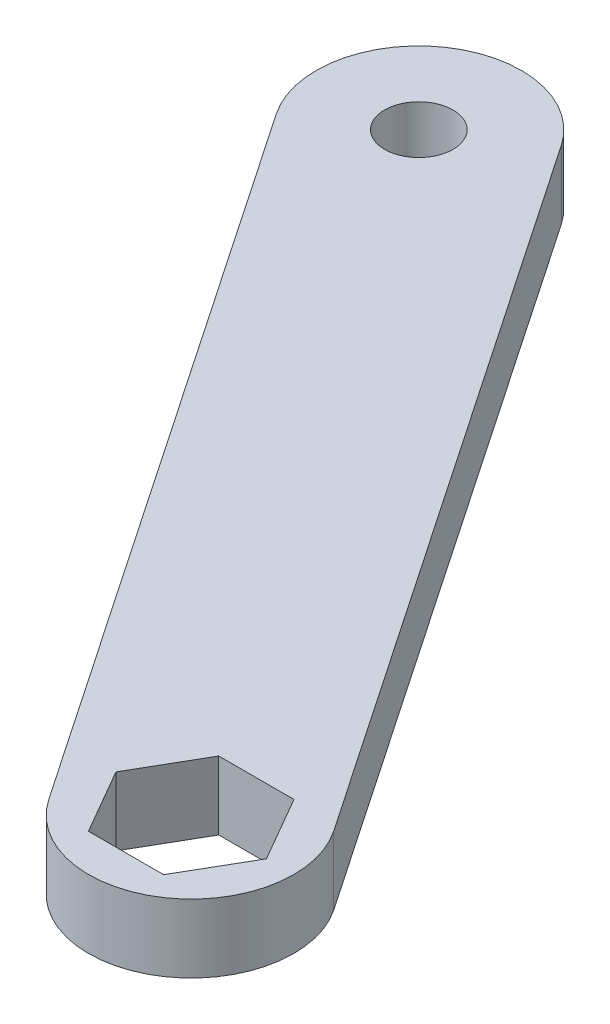
ISO-10303-21;
HEADER;
FILE_DESCRIPTION(('STEP AP214'),'2;1');
FILE_NAME('part.step','',(''),(''),'','','');
FILE_SCHEMA(('AUTOMOTIVE_DESIGN { 1 0 10303 214 1 1 1 1 }'));
ENDSEC;
DATA;
#1=APPLICATION_CONTEXT('core data for automotive mechanical design processes');
#2=APPLICATION_PROTOCOL_DEFINITION('international standard','automotive_design',2000,#1);
#3=PRODUCT_CONTEXT('',#1,'mechanical');
#4=PRODUCT('Part','Part','',(#3));
#5=PRODUCT_RELATED_PRODUCT_CATEGORY('part','',(#4));
#6=PRODUCT_DEFINITION_FORMATION('','',#4);
#7=PRODUCT_DEFINITION_CONTEXT('part definition',#1,'design');
#8=PRODUCT_DEFINITION('design','',#6,#7);
#9=PRODUCT_DEFINITION_SHAPE('','',#8);
#10=(LENGTH_UNIT() NAMED_UNIT(*) SI_UNIT(.MILLI.,.METRE.));
#11=(NAMED_UNIT(*) PLANE_ANGLE_UNIT() SI_UNIT($,.RADIAN.));
#12=(NAMED_UNIT(*) SI_UNIT($,.STERADIAN.) SOLID_ANGLE_UNIT());
#13=UNCERTAINTY_MEASURE_WITH_UNIT(LENGTH_MEASURE(1.E-05),#10,'distance_accuracy_value','');
#14=(GEOMETRIC_REPRESENTATION_CONTEXT(3) GLOBAL_UNCERTAINTY_ASSIGNED_CONTEXT((#13)) GLOBAL_UNIT_ASSIGNED_CONTEXT((#10,
#11,#12)) REPRESENTATION_CONTEXT('',''));
#15=CARTESIAN_POINT('',(0.,0.,0.));
#16=DIRECTION('',(0.,0.,1.));
#17=DIRECTION('',(1.,0.,0.));
#18=AXIS2_PLACEMENT_3D('',#15,#16,#17);
#19=CARTESIAN_POINT('',(-8.5725,-5.,-27.2588126804892));
#20=DIRECTION('',(0.,1.,0.));
#21=DIRECTION('',(0.,0.,1.));
#22=AXIS2_PLACEMENT_3D('',#19,#20,#21);
#23=CYLINDRICAL_SURFACE('',#22,7.49926131403121);
#24=CARTESIAN_POINT('',(-8.5725,0.,-27.2588126804892));
#25=DIRECTION('',(0.,1.,0.));
#26=DIRECTION('',(0.,0.,1.));
#27=AXIS2_PLACEMENT_3D('',#24,#25,#26);
#28=CIRCLE('',#27,7.49926131403121);
#29=CARTESIAN_POINT('',(-14.7786134569005,0.,-23.0489342955232));
#30=VERTEX_POINT('',#29);
#31=CARTESIAN_POINT('',(-2.36638654309953,0.,-31.4686910654552));
#32=VERTEX_POINT('',#31);
#33=EDGE_CURVE('E165',#30,#32,#28,.T.);
#34=ORIENTED_EDGE('',*,*,#33,.F.);
#35=DIRECTION('',(0.,1.,0.));
#36=VECTOR('',#35,1.);
#37=CARTESIAN_POINT('',(-14.7786134569005,-5.,-23.0489342955232));
#38=LINE('',#37,#36);
#39=CARTESIAN_POINT('',(-14.7786134569005,-5.,-23.0489342955232));
#40=VERTEX_POINT('',#39);
#41=EDGE_CURVE('E11',#40,#30,#38,.T.);
#42=ORIENTED_EDGE('',*,*,#41,.F.);
#43=CARTESIAN_POINT('',(-8.5725,-5.,-27.2588126804892));
#44=DIRECTION('',(0.,1.,0.));
#45=DIRECTION('',(0.,0.,1.));
#46=AXIS2_PLACEMENT_3D('',#43,#44,#45);
#47=CIRCLE('',#46,7.49926131403121);
#48=CARTESIAN_POINT('',(-2.36638654309953,-5.,-31.4686910654552));
#49=VERTEX_POINT('',#48);
#50=EDGE_CURVE('E173',#40,#49,#47,.T.);
#51=ORIENTED_EDGE('',*,*,#50,.T.);
#52=DIRECTION('',(0.,1.,0.));
#53=VECTOR('',#52,1.);
#54=CARTESIAN_POINT('',(-2.36638654309953,-5.,-31.4686910654552));
#55=LINE('',#54,#53);
#56=EDGE_CURVE('E42',#49,#32,#55,.T.);
#57=ORIENTED_EDGE('',*,*,#56,.T.);
#58=EDGE_LOOP('',(#34,#42,#51,#57));
#59=FACE_BOUND('',#58,.T.);
#60=ADVANCED_FACE('F39',(#59),#23,.T.);
#61=CARTESIAN_POINT('',(-49.8643889809616,-5.,-74.7716406813572));
#62=DIRECTION('',(-0.827563302173344,0.,0.561372408384979));
#63=DIRECTION('',(0.561372408384979,0.,0.827563302173344));
#64=AXIS2_PLACEMENT_3D('',#61,#62,#63);
#65=PLANE('',#64);
#66=DIRECTION('',(0.561372408384979,0.,0.827563302173344));
#67=VECTOR('',#66,1.);
#68=CARTESIAN_POINT('',(-49.8643889809616,0.,-74.7716406813572));
#69=LINE('',#68,#67);
#70=CARTESIAN_POINT('',(-49.8643889809616,0.,-74.7716406813572));
#71=VERTEX_POINT('',#70);
#72=EDGE_CURVE('E177',#71,#30,#69,.T.);
#73=ORIENTED_EDGE('',*,*,#72,.F.);
#74=DIRECTION('',(0.,1.,0.));
#75=VECTOR('',#74,1.);
#76=CARTESIAN_POINT('',(-49.8643889809616,-5.,-74.7716406813572));
#77=LINE('',#76,#75);
#78=CARTESIAN_POINT('',(-49.8643889809616,-5.,-74.7716406813572));
#79=VERTEX_POINT('',#78);
#80=EDGE_CURVE('E47',#79,#71,#77,.T.);
#81=ORIENTED_EDGE('',*,*,#80,.F.);
#82=DIRECTION('',(0.561372408384979,0.,0.827563302173344));
#83=VECTOR('',#82,1.);
#84=CARTESIAN_POINT('',(-49.8643889809616,-5.,-74.7716406813572));
#85=LINE('',#84,#83);
#86=EDGE_CURVE('E183',#79,#40,#85,.T.);
#87=ORIENTED_EDGE('',*,*,#86,.T.);
#88=ORIENTED_EDGE('',*,*,#41,.T.);
#89=EDGE_LOOP('',(#73,#81,#87,#88));
#90=FACE_BOUND('',#89,.T.);
#91=ADVANCED_FACE('F209',(#90),#65,.T.);
#92=CARTESIAN_POINT('',(-43.6582755240612,-5.,-78.9815190663232));
#93=DIRECTION('',(0.,1.,0.));
#94=DIRECTION('',(0.,0.,1.));
#95=AXIS2_PLACEMENT_3D('',#92,#93,#94);
#96=CYLINDRICAL_SURFACE('',#95,7.4992613140312);
#97=CARTESIAN_POINT('',(-43.6582755240612,0.,-78.9815190663232));
#98=DIRECTION('',(0.,1.,0.));
#99=DIRECTION('',(0.,0.,1.));
#100=AXIS2_PLACEMENT_3D('',#97,#98,#99);
#101=CIRCLE('',#100,7.4992613140312);
#102=CARTESIAN_POINT('',(-37.4521620671607,0.,-83.1913974512892));
#103=VERTEX_POINT('',#102);
#104=EDGE_CURVE('E191',#103,#71,#101,.T.);
#105=ORIENTED_EDGE('',*,*,#104,.F.);
#106=DIRECTION('',(0.,1.,0.));
#107=VECTOR('',#106,1.);
#108=CARTESIAN_POINT('',(-37.4521620671607,-5.,-83.1913974512892));
#109=LINE('',#108,#107);
#110=CARTESIAN_POINT('',(-37.4521620671607,-5.,-83.1913974512892));
#111=VERTEX_POINT('',#110);
#112=EDGE_CURVE('E196',#111,#103,#109,.T.);
#113=ORIENTED_EDGE('',*,*,#112,.F.);
#114=CARTESIAN_POINT('',(-43.6582755240612,-5.,-78.9815190663232));
#115=DIRECTION('',(0.,1.,0.));
#116=DIRECTION('',(0.,0.,1.));
#117=AXIS2_PLACEMENT_3D('',#114,#115,#116);
#118=CIRCLE('',#117,7.4992613140312);
#119=EDGE_CURVE('E180',#111,#79,#118,.T.);
#120=ORIENTED_EDGE('',*,*,#119,.T.);
#121=ORIENTED_EDGE('',*,*,#80,.T.);
#122=EDGE_LOOP('',(#105,#113,#120,#121));
#123=FACE_BOUND('',#122,.T.);
#124=ADVANCED_FACE('F213',(#123),#96,.T.);
#125=CARTESIAN_POINT('',(-37.4521620671607,-5.,-83.1913974512892));
#126=DIRECTION('',(0.827563302173343,0.,-0.561372408384979));
#127=DIRECTION('',(-0.561372408384979,0.,-0.827563302173343));
#128=AXIS2_PLACEMENT_3D('',#125,#126,#127);
#129=PLANE('',#128);
#130=DIRECTION('',(-0.561372408384979,0.,-0.827563302173343));
#131=VECTOR('',#130,1.);
#132=CARTESIAN_POINT('',(-37.4521620671607,0.,-83.1913974512892));
#133=LINE('',#132,#131);
#134=EDGE_CURVE('E188',#32,#103,#133,.T.);
#135=ORIENTED_EDGE('',*,*,#134,.F.);
#136=ORIENTED_EDGE('',*,*,#56,.F.);
#137=DIRECTION('',(-0.561372408384979,0.,-0.827563302173343));
#138=VECTOR('',#137,1.);
#139=CARTESIAN_POINT('',(-37.4521620671607,-5.,-83.1913974512892));
#140=LINE('',#139,#138);
#141=EDGE_CURVE('E176',#49,#111,#140,.T.);
#142=ORIENTED_EDGE('',*,*,#141,.T.);
#143=ORIENTED_EDGE('',*,*,#112,.T.);
#144=EDGE_LOOP('',(#135,#136,#142,#143));
#145=FACE_BOUND('',#144,.T.);
#146=ADVANCED_FACE('F204',(#145),#129,.T.);
#147=CARTESIAN_POINT('',(-8.5725,-5.,-27.2588126804892));
#148=DIRECTION('',(0.,1.,0.));
#149=DIRECTION('',(0.,0.,1.));
#150=AXIS2_PLACEMENT_3D('',#147,#148,#149);
#151=PLANE('',#150);
#152=CARTESIAN_POINT('',(-43.6582755240612,-5.,-78.9815190663232));
#153=DIRECTION('',(0.,1.,0.));
#154=DIRECTION('',(0.,0.,1.));
#155=AXIS2_PLACEMENT_3D('',#152,#153,#154);
#156=CIRCLE('',#155,2.5);
#157=CARTESIAN_POINT('',(-43.6582755240612,-5.,-76.4815190663232));
#158=VERTEX_POINT('',#157);
#159=EDGE_CURVE('E153',#158,#158,#156,.T.);
#160=ORIENTED_EDGE('',*,*,#159,.T.);
#161=EDGE_LOOP('',(#160));
#162=FACE_BOUND('',#161,.T.);
#163=DIRECTION('',(-1.,0.,0.));
#164=VECTOR('',#163,1.);
#165=CARTESIAN_POINT('',(-5.8228693429844,-5.,-32.0213126804892));
#166=LINE('',#165,#164);
#167=CARTESIAN_POINT('',(-5.8228693429844,-5.,-32.0213126804892));
#168=VERTEX_POINT('',#167);
#169=CARTESIAN_POINT('',(-11.3221306570156,-5.,-32.0213126804892));
#170=VERTEX_POINT('',#169);
#171=EDGE_CURVE('E124',#168,#170,#166,.T.);
#172=ORIENTED_EDGE('',*,*,#171,.T.);
#173=DIRECTION('',(-0.5,0.,0.866025403784439));
#174=VECTOR('',#173,1.);
#175=CARTESIAN_POINT('',(-11.3221306570156,-5.,-32.0213126804892));
#176=LINE('',#175,#174);
#177=CARTESIAN_POINT('',(-14.0717613140312,-5.,-27.2588126804892));
#178=VERTEX_POINT('',#177);
#179=EDGE_CURVE('E118',#170,#178,#176,.T.);
#180=ORIENTED_EDGE('',*,*,#179,.T.);
#181=DIRECTION('',(0.5,0.,0.866025403784439));
#182=VECTOR('',#181,1.);
#183=CARTESIAN_POINT('',(-14.0717613140312,-5.,-27.2588126804892));
#184=LINE('',#183,#182);
#185=CARTESIAN_POINT('',(-11.3221306570156,-5.,-22.4963126804892));
#186=VERTEX_POINT('',#185);
#187=EDGE_CURVE('E127',#178,#186,#184,.T.);
#188=ORIENTED_EDGE('',*,*,#187,.T.);
#189=DIRECTION('',(1.,0.,0.));
#190=VECTOR('',#189,1.);
#191=CARTESIAN_POINT('',(-11.3221306570156,-5.,-22.4963126804892));
#192=LINE('',#191,#190);
#193=CARTESIAN_POINT('',(-5.8228693429844,-5.,-22.4963126804892));
#194=VERTEX_POINT('',#193);
#195=EDGE_CURVE('E55',#186,#194,#192,.T.);
#196=ORIENTED_EDGE('',*,*,#195,.T.);
#197=DIRECTION('',(0.5,0.,-0.866025403784439));
#198=VECTOR('',#197,1.);
#199=CARTESIAN_POINT('',(-5.8228693429844,-5.,-22.4963126804892));
#200=LINE('',#199,#198);
#201=CARTESIAN_POINT('',(-3.07323868596881,-5.,-27.2588126804892));
#202=VERTEX_POINT('',#201);
#203=EDGE_CURVE('E145',#194,#202,#200,.T.);
#204=ORIENTED_EDGE('',*,*,#203,.T.);
#205=DIRECTION('',(-0.5,0.,-0.866025403784439));
#206=VECTOR('',#205,1.);
#207=CARTESIAN_POINT('',(-3.07323868596881,-5.,-27.2588126804892));
#208=LINE('',#207,#206);
#209=EDGE_CURVE('E148',#202,#168,#208,.T.);
#210=ORIENTED_EDGE('',*,*,#209,.T.);
#211=EDGE_LOOP('',(#172,#180,#188,#196,#204,#210));
#212=FACE_BOUND('',#211,.T.);
#213=ORIENTED_EDGE('',*,*,#50,.F.);
#214=ORIENTED_EDGE('',*,*,#86,.F.);
#215=ORIENTED_EDGE('',*,*,#119,.F.);
#216=ORIENTED_EDGE('',*,*,#141,.F.);
#217=EDGE_LOOP('',(#213,#214,#215,#216));
#218=FACE_BOUND('',#217,.T.);
#219=ADVANCED_FACE('F131',(#162,#212,#218),#151,.F.);
#220=CARTESIAN_POINT('',(-8.5725,0.,-27.2588126804892));
#221=DIRECTION('',(0.,1.,0.));
#222=DIRECTION('',(0.,0.,1.));
#223=AXIS2_PLACEMENT_3D('',#220,#221,#222);
#224=PLANE('',#223);
#225=CARTESIAN_POINT('',(-43.6582755240612,0.,-78.9815190663232));
#226=DIRECTION('',(0.,1.,0.));
#227=DIRECTION('',(0.,0.,1.));
#228=AXIS2_PLACEMENT_3D('',#225,#226,#227);
#229=CIRCLE('',#228,2.5);
#230=CARTESIAN_POINT('',(-43.6582755240612,0.,-76.4815190663232));
#231=VERTEX_POINT('',#230);
#232=EDGE_CURVE('E141',#231,#231,#229,.T.);
#233=ORIENTED_EDGE('',*,*,#232,.F.);
#234=EDGE_LOOP('',(#233));
#235=FACE_BOUND('',#234,.T.);
#236=DIRECTION('',(-0.5,0.,0.866025403784439));
#237=VECTOR('',#236,1.);
#238=CARTESIAN_POINT('',(-11.3221306570156,0.,-32.0213126804892));
#239=LINE('',#238,#237);
#240=CARTESIAN_POINT('',(-11.3221306570156,0.,-32.0213126804892));
#241=VERTEX_POINT('',#240);
#242=CARTESIAN_POINT('',(-14.0717613140312,0.,-27.2588126804892));
#243=VERTEX_POINT('',#242);
#244=EDGE_CURVE('E63',#241,#243,#239,.T.);
#245=ORIENTED_EDGE('',*,*,#244,.F.);
#246=DIRECTION('',(-1.,0.,0.));
#247=VECTOR('',#246,1.);
#248=CARTESIAN_POINT('',(-5.8228693429844,0.,-32.0213126804892));
#249=LINE('',#248,#247);
#250=CARTESIAN_POINT('',(-5.8228693429844,0.,-32.0213126804892));
#251=VERTEX_POINT('',#250);
#252=EDGE_CURVE('E135',#251,#241,#249,.T.);
#253=ORIENTED_EDGE('',*,*,#252,.F.);
#254=DIRECTION('',(-0.5,0.,-0.866025403784439));
#255=VECTOR('',#254,1.);
#256=CARTESIAN_POINT('',(-3.07323868596881,0.,-27.2588126804892));
#257=LINE('',#256,#255);
#258=CARTESIAN_POINT('',(-3.07323868596881,0.,-27.2588126804892));
#259=VERTEX_POINT('',#258);
#260=EDGE_CURVE('E138',#259,#251,#257,.T.);
#261=ORIENTED_EDGE('',*,*,#260,.F.);
#262=DIRECTION('',(0.5,0.,-0.866025403784439));
#263=VECTOR('',#262,1.);
#264=CARTESIAN_POINT('',(-5.8228693429844,0.,-22.4963126804892));
#265=LINE('',#264,#263);
#266=CARTESIAN_POINT('',(-5.8228693429844,0.,-22.4963126804892));
#267=VERTEX_POINT('',#266);
#268=EDGE_CURVE('E158',#267,#259,#265,.T.);
#269=ORIENTED_EDGE('',*,*,#268,.F.);
#270=DIRECTION('',(1.,0.,0.));
#271=VECTOR('',#270,1.);
#272=CARTESIAN_POINT('',(-11.3221306570156,0.,-22.4963126804892));
#273=LINE('',#272,#271);
#274=CARTESIAN_POINT('',(-11.3221306570156,0.,-22.4963126804892));
#275=VERTEX_POINT('',#274);
#276=EDGE_CURVE('E155',#275,#267,#273,.T.);
#277=ORIENTED_EDGE('',*,*,#276,.F.);
#278=DIRECTION('',(0.5,0.,0.866025403784439));
#279=VECTOR('',#278,1.);
#280=CARTESIAN_POINT('',(-14.0717613140312,0.,-27.2588126804892));
#281=LINE('',#280,#279);
#282=EDGE_CURVE('E152',#243,#275,#281,.T.);
#283=ORIENTED_EDGE('',*,*,#282,.F.);
#284=EDGE_LOOP('',(#245,#253,#261,#269,#277,#283));
#285=FACE_BOUND('',#284,.T.);
#286=ORIENTED_EDGE('',*,*,#33,.T.);
#287=ORIENTED_EDGE('',*,*,#134,.T.);
#288=ORIENTED_EDGE('',*,*,#104,.T.);
#289=ORIENTED_EDGE('',*,*,#72,.T.);
#290=EDGE_LOOP('',(#286,#287,#288,#289));
#291=FACE_BOUND('',#290,.T.);
#292=ADVANCED_FACE('F206',(#235,#285,#291),#224,.T.);
#293=CARTESIAN_POINT('',(-11.3221306570156,-5.,-32.0213126804892));
#294=DIRECTION('',(-0.866025403784439,0.,-0.5));
#295=DIRECTION('',(-0.5,0.,0.866025403784439));
#296=AXIS2_PLACEMENT_3D('',#293,#294,#295);
#297=PLANE('',#296);
#298=ORIENTED_EDGE('',*,*,#244,.T.);
#299=DIRECTION('',(0.,1.,0.));
#300=VECTOR('',#299,1.);
#301=CARTESIAN_POINT('',(-14.0717613140312,-5.,-27.2588126804892));
#302=LINE('',#301,#300);
#303=EDGE_CURVE('E114',#178,#243,#302,.T.);
#304=ORIENTED_EDGE('',*,*,#303,.F.);
#305=ORIENTED_EDGE('',*,*,#179,.F.);
#306=DIRECTION('',(0.,1.,0.));
#307=VECTOR('',#306,1.);
#308=CARTESIAN_POINT('',(-11.3221306570156,-5.,-32.0213126804892));
#309=LINE('',#308,#307);
#310=EDGE_CURVE('E163',#170,#241,#309,.T.);
#311=ORIENTED_EDGE('',*,*,#310,.T.);
#312=EDGE_LOOP('',(#298,#304,#305,#311));
#313=FACE_BOUND('',#312,.T.);
#314=ADVANCED_FACE('F116',(#313),#297,.F.);
#315=CARTESIAN_POINT('',(-5.8228693429844,-5.,-32.0213126804892));
#316=DIRECTION('',(0.,0.,-1.));
#317=DIRECTION('',(-1.,0.,0.));
#318=AXIS2_PLACEMENT_3D('',#315,#316,#317);
#319=PLANE('',#318);
#320=ORIENTED_EDGE('',*,*,#252,.T.);
#321=ORIENTED_EDGE('',*,*,#310,.F.);
#322=ORIENTED_EDGE('',*,*,#171,.F.);
#323=DIRECTION('',(0.,1.,0.));
#324=VECTOR('',#323,1.);
#325=CARTESIAN_POINT('',(-5.8228693429844,-5.,-32.0213126804892));
#326=LINE('',#325,#324);
#327=EDGE_CURVE('E166',#168,#251,#326,.T.);
#328=ORIENTED_EDGE('',*,*,#327,.T.);
#329=EDGE_LOOP('',(#320,#321,#322,#328));
#330=FACE_BOUND('',#329,.T.);
#331=ADVANCED_FACE('F267',(#330),#319,.F.);
#332=CARTESIAN_POINT('',(-3.07323868596881,-5.,-27.2588126804892));
#333=DIRECTION('',(0.866025403784439,0.,-0.5));
#334=DIRECTION('',(-0.5,0.,-0.866025403784439));
#335=AXIS2_PLACEMENT_3D('',#332,#333,#334);
#336=PLANE('',#335);
#337=ORIENTED_EDGE('',*,*,#260,.T.);
#338=ORIENTED_EDGE('',*,*,#327,.F.);
#339=ORIENTED_EDGE('',*,*,#209,.F.);
#340=DIRECTION('',(0.,1.,0.));
#341=VECTOR('',#340,1.);
#342=CARTESIAN_POINT('',(-3.07323868596881,-5.,-27.2588126804892));
#343=LINE('',#342,#341);
#344=EDGE_CURVE('E168',#202,#259,#343,.T.);
#345=ORIENTED_EDGE('',*,*,#344,.T.);
#346=EDGE_LOOP('',(#337,#338,#339,#345));
#347=FACE_BOUND('',#346,.T.);
#348=ADVANCED_FACE('F276',(#347),#336,.F.);
#349=CARTESIAN_POINT('',(-5.8228693429844,-5.,-22.4963126804892));
#350=DIRECTION('',(0.866025403784439,0.,0.5));
#351=DIRECTION('',(0.5,0.,-0.866025403784439));
#352=AXIS2_PLACEMENT_3D('',#349,#350,#351);
#353=PLANE('',#352);
#354=ORIENTED_EDGE('',*,*,#268,.T.);
#355=ORIENTED_EDGE('',*,*,#344,.F.);
#356=ORIENTED_EDGE('',*,*,#203,.F.);
#357=DIRECTION('',(0.,1.,0.));
#358=VECTOR('',#357,1.);
#359=CARTESIAN_POINT('',(-5.8228693429844,-5.,-22.4963126804892));
#360=LINE('',#359,#358);
#361=EDGE_CURVE('E170',#194,#267,#360,.T.);
#362=ORIENTED_EDGE('',*,*,#361,.T.);
#363=EDGE_LOOP('',(#354,#355,#356,#362));
#364=FACE_BOUND('',#363,.T.);
#365=ADVANCED_FACE('F286',(#364),#353,.F.);
#366=CARTESIAN_POINT('',(-11.3221306570156,-5.,-22.4963126804892));
#367=DIRECTION('',(0.,0.,1.));
#368=DIRECTION('',(1.,0.,0.));
#369=AXIS2_PLACEMENT_3D('',#366,#367,#368);
#370=PLANE('',#369);
#371=ORIENTED_EDGE('',*,*,#276,.T.);
#372=ORIENTED_EDGE('',*,*,#361,.F.);
#373=ORIENTED_EDGE('',*,*,#195,.F.);
#374=DIRECTION('',(0.,1.,0.));
#375=VECTOR('',#374,1.);
#376=CARTESIAN_POINT('',(-11.3221306570156,-5.,-22.4963126804892));
#377=LINE('',#376,#375);
#378=EDGE_CURVE('E123',#186,#275,#377,.T.);
#379=ORIENTED_EDGE('',*,*,#378,.T.);
#380=EDGE_LOOP('',(#371,#372,#373,#379));
#381=FACE_BOUND('',#380,.T.);
#382=ADVANCED_FACE('F296',(#381),#370,.F.);
#383=CARTESIAN_POINT('',(-14.0717613140312,-5.,-27.2588126804892));
#384=DIRECTION('',(-0.866025403784439,0.,0.5));
#385=DIRECTION('',(0.5,0.,0.866025403784439));
#386=AXIS2_PLACEMENT_3D('',#383,#384,#385);
#387=PLANE('',#386);
#388=ORIENTED_EDGE('',*,*,#282,.T.);
#389=ORIENTED_EDGE('',*,*,#378,.F.);
#390=ORIENTED_EDGE('',*,*,#187,.F.);
#391=ORIENTED_EDGE('',*,*,#303,.T.);
#392=EDGE_LOOP('',(#388,#389,#390,#391));
#393=FACE_BOUND('',#392,.T.);
#394=ADVANCED_FACE('F128',(#393),#387,.F.);
#395=CARTESIAN_POINT('',(-43.6582755240612,-5.,-78.9815190663232));
#396=DIRECTION('',(0.,1.,0.));
#397=DIRECTION('',(0.,0.,1.));
#398=AXIS2_PLACEMENT_3D('',#395,#396,#397);
#399=CYLINDRICAL_SURFACE('',#398,2.5);
#400=ORIENTED_EDGE('',*,*,#159,.F.);
#401=EDGE_LOOP('',(#400));
#402=FACE_BOUND('',#401,.T.);
#403=ORIENTED_EDGE('',*,*,#232,.T.);
#404=EDGE_LOOP('',(#403));
#405=FACE_BOUND('',#404,.T.);
#406=ADVANCED_FACE('F314',(#402,#405),#399,.F.);
#407=CLOSED_SHELL('',(#60,#91,#124,#146,#219,#292,#314,#331,#348,#365,#382,#394,#406));
#408=MANIFOLD_SOLID_BREP('B2',#407);
#409=ADVANCED_BREP_SHAPE_REPRESENTATION('',(#18,#408),#14);
#410=SHAPE_DEFINITION_REPRESENTATION(#9,#409);
ENDSEC;
END-ISO-10303-21;
